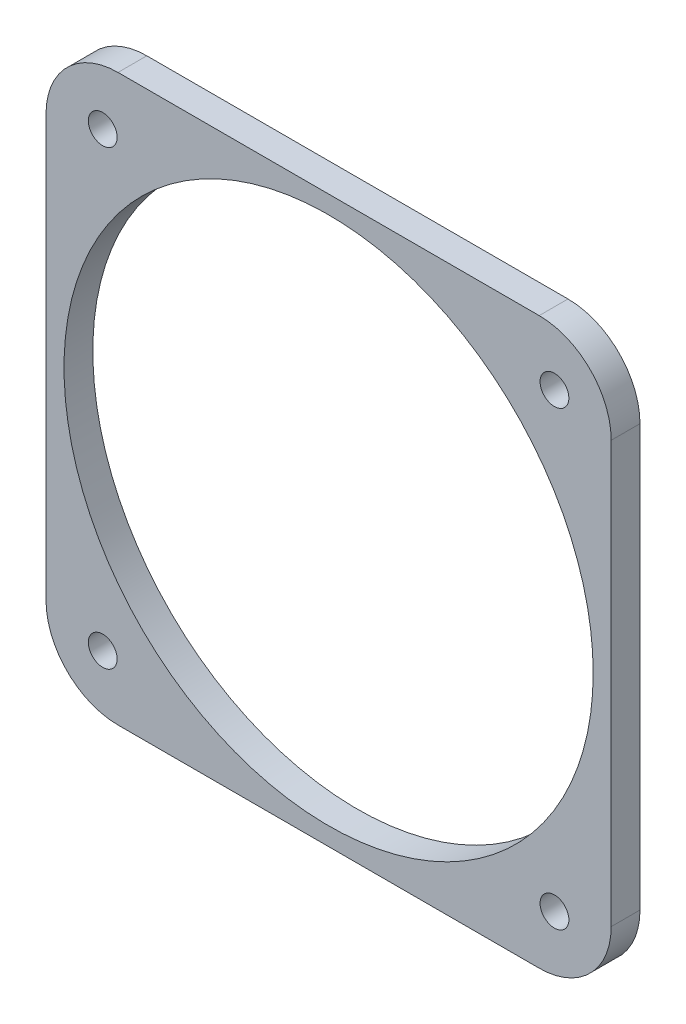
ISO-10303-21;
HEADER;
FILE_DESCRIPTION(('STEP AP214'),'2;1');
FILE_NAME('part.step','',(''),(''),'','','');
FILE_SCHEMA(('AUTOMOTIVE_DESIGN { 1 0 10303 214 1 1 1 1 }'));
ENDSEC;
DATA;
#1=APPLICATION_CONTEXT('core data for automotive mechanical design processes');
#2=APPLICATION_PROTOCOL_DEFINITION('international standard','automotive_design',2000,#1);
#3=PRODUCT_CONTEXT('',#1,'mechanical');
#4=PRODUCT('Part','Part','',(#3));
#5=PRODUCT_RELATED_PRODUCT_CATEGORY('part','',(#4));
#6=PRODUCT_DEFINITION_FORMATION('','',#4);
#7=PRODUCT_DEFINITION_CONTEXT('part definition',#1,'design');
#8=PRODUCT_DEFINITION('design','',#6,#7);
#9=PRODUCT_DEFINITION_SHAPE('','',#8);
#10=(LENGTH_UNIT() NAMED_UNIT(*) SI_UNIT(.MILLI.,.METRE.));
#11=(NAMED_UNIT(*) PLANE_ANGLE_UNIT() SI_UNIT($,.RADIAN.));
#12=(NAMED_UNIT(*) SI_UNIT($,.STERADIAN.) SOLID_ANGLE_UNIT());
#13=UNCERTAINTY_MEASURE_WITH_UNIT(LENGTH_MEASURE(1.E-05),#10,'distance_accuracy_value','');
#14=(GEOMETRIC_REPRESENTATION_CONTEXT(3) GLOBAL_UNCERTAINTY_ASSIGNED_CONTEXT((#13)) GLOBAL_UNIT_ASSIGNED_CONTEXT((#10,
#11,#12)) REPRESENTATION_CONTEXT('',''));
#15=CARTESIAN_POINT('',(0.,0.,0.));
#16=DIRECTION('',(0.,0.,1.));
#17=DIRECTION('',(1.,0.,0.));
#18=AXIS2_PLACEMENT_3D('',#15,#16,#17);
#19=CARTESIAN_POINT('',(39.25,-39.25,2.));
#20=DIRECTION('',(-1.,0.,0.));
#21=DIRECTION('',(0.,0.,1.));
#22=AXIS2_PLACEMENT_3D('',#19,#20,#21);
#23=PLANE('',#22);
#24=DIRECTION('',(0.,1.,0.));
#25=VECTOR('',#24,1.);
#26=CARTESIAN_POINT('',(39.25,-39.25,2.));
#27=LINE('',#26,#25);
#28=CARTESIAN_POINT('',(39.25,-29.25,2.));
#29=VERTEX_POINT('',#28);
#30=CARTESIAN_POINT('',(39.25,29.25,2.));
#31=VERTEX_POINT('',#30);
#32=EDGE_CURVE('E139',#29,#31,#27,.T.);
#33=ORIENTED_EDGE('',*,*,#32,.F.);
#34=DIRECTION('',(0.,0.,-1.));
#35=VECTOR('',#34,1.);
#36=CARTESIAN_POINT('',(39.25,-29.25,2.));
#37=LINE('',#36,#35);
#38=CARTESIAN_POINT('',(39.25,-29.25,-2.));
#39=VERTEX_POINT('',#38);
#40=EDGE_CURVE('E178',#29,#39,#37,.T.);
#41=ORIENTED_EDGE('',*,*,#40,.T.);
#42=DIRECTION('',(0.,1.,0.));
#43=VECTOR('',#42,1.);
#44=CARTESIAN_POINT('',(39.25,-39.25,-2.));
#45=LINE('',#44,#43);
#46=CARTESIAN_POINT('',(39.25,29.25,-2.));
#47=VERTEX_POINT('',#46);
#48=EDGE_CURVE('E193',#39,#47,#45,.T.);
#49=ORIENTED_EDGE('',*,*,#48,.T.);
#50=DIRECTION('',(0.,0.,-1.));
#51=VECTOR('',#50,1.);
#52=CARTESIAN_POINT('',(39.25,29.25,2.));
#53=LINE('',#52,#51);
#54=EDGE_CURVE('E175',#47,#31,#53,.F.);
#55=ORIENTED_EDGE('',*,*,#54,.T.);
#56=EDGE_LOOP('',(#33,#41,#49,#55));
#57=FACE_BOUND('',#56,.T.);
#58=ADVANCED_FACE('F43',(#57),#23,.F.);
#59=CARTESIAN_POINT('',(-39.25,39.25,2.));
#60=DIRECTION('',(0.,-1.,0.));
#61=DIRECTION('',(0.,0.,-1.));
#62=AXIS2_PLACEMENT_3D('',#59,#60,#61);
#63=PLANE('',#62);
#64=DIRECTION('',(-1.,0.,0.));
#65=VECTOR('',#64,1.);
#66=CARTESIAN_POINT('',(-39.25,39.25,2.));
#67=LINE('',#66,#65);
#68=CARTESIAN_POINT('',(29.25,39.25,2.));
#69=VERTEX_POINT('',#68);
#70=CARTESIAN_POINT('',(-29.25,39.25,2.));
#71=VERTEX_POINT('',#70);
#72=EDGE_CURVE('E144',#69,#71,#67,.T.);
#73=ORIENTED_EDGE('',*,*,#72,.F.);
#74=DIRECTION('',(0.,0.,-1.));
#75=VECTOR('',#74,1.);
#76=CARTESIAN_POINT('',(29.25,39.25,2.));
#77=LINE('',#76,#75);
#78=CARTESIAN_POINT('',(29.25,39.25,-2.));
#79=VERTEX_POINT('',#78);
#80=EDGE_CURVE('E11',#69,#79,#77,.T.);
#81=ORIENTED_EDGE('',*,*,#80,.T.);
#82=DIRECTION('',(-1.,0.,0.));
#83=VECTOR('',#82,1.);
#84=CARTESIAN_POINT('',(-39.25,39.25,-2.));
#85=LINE('',#84,#83);
#86=CARTESIAN_POINT('',(-29.25,39.25,-2.));
#87=VERTEX_POINT('',#86);
#88=EDGE_CURVE('E146',#79,#87,#85,.T.);
#89=ORIENTED_EDGE('',*,*,#88,.T.);
#90=DIRECTION('',(0.,0.,-1.));
#91=VECTOR('',#90,1.);
#92=CARTESIAN_POINT('',(-29.25,39.25,2.));
#93=LINE('',#92,#91);
#94=EDGE_CURVE('E52',#87,#71,#93,.F.);
#95=ORIENTED_EDGE('',*,*,#94,.T.);
#96=EDGE_LOOP('',(#73,#81,#89,#95));
#97=FACE_BOUND('',#96,.T.);
#98=ADVANCED_FACE('F199',(#97),#63,.F.);
#99=CARTESIAN_POINT('',(-39.25,-39.25,2.));
#100=DIRECTION('',(1.,0.,0.));
#101=DIRECTION('',(0.,0.,-1.));
#102=AXIS2_PLACEMENT_3D('',#99,#100,#101);
#103=PLANE('',#102);
#104=DIRECTION('',(0.,-1.,0.));
#105=VECTOR('',#104,1.);
#106=CARTESIAN_POINT('',(-39.25,-39.25,-2.));
#107=LINE('',#106,#105);
#108=CARTESIAN_POINT('',(-39.25,29.25,-2.));
#109=VERTEX_POINT('',#108);
#110=CARTESIAN_POINT('',(-39.25,-29.25,-2.));
#111=VERTEX_POINT('',#110);
#112=EDGE_CURVE('E140',#109,#111,#107,.T.);
#113=ORIENTED_EDGE('',*,*,#112,.T.);
#114=DIRECTION('',(0.,0.,-1.));
#115=VECTOR('',#114,1.);
#116=CARTESIAN_POINT('',(-39.25,-29.25,2.));
#117=LINE('',#116,#115);
#118=CARTESIAN_POINT('',(-39.25,-29.25,2.));
#119=VERTEX_POINT('',#118);
#120=EDGE_CURVE('E115',#111,#119,#117,.F.);
#121=ORIENTED_EDGE('',*,*,#120,.T.);
#122=DIRECTION('',(0.,-1.,0.));
#123=VECTOR('',#122,1.);
#124=CARTESIAN_POINT('',(-39.25,-39.25,2.));
#125=LINE('',#124,#123);
#126=CARTESIAN_POINT('',(-39.25,29.25,2.));
#127=VERTEX_POINT('',#126);
#128=EDGE_CURVE('E184',#127,#119,#125,.T.);
#129=ORIENTED_EDGE('',*,*,#128,.F.);
#130=DIRECTION('',(0.,0.,-1.));
#131=VECTOR('',#130,1.);
#132=CARTESIAN_POINT('',(-39.25,29.25,2.));
#133=LINE('',#132,#131);
#134=EDGE_CURVE('E121',#127,#109,#133,.T.);
#135=ORIENTED_EDGE('',*,*,#134,.T.);
#136=EDGE_LOOP('',(#113,#121,#129,#135));
#137=FACE_BOUND('',#136,.T.);
#138=ADVANCED_FACE('F206',(#137),#103,.F.);
#139=CARTESIAN_POINT('',(-39.25,-39.25,2.));
#140=DIRECTION('',(0.,1.,0.));
#141=DIRECTION('',(0.,0.,1.));
#142=AXIS2_PLACEMENT_3D('',#139,#140,#141);
#143=PLANE('',#142);
#144=DIRECTION('',(1.,0.,0.));
#145=VECTOR('',#144,1.);
#146=CARTESIAN_POINT('',(-39.25,-39.25,2.));
#147=LINE('',#146,#145);
#148=CARTESIAN_POINT('',(-29.25,-39.25,2.));
#149=VERTEX_POINT('',#148);
#150=CARTESIAN_POINT('',(29.25,-39.25,2.));
#151=VERTEX_POINT('',#150);
#152=EDGE_CURVE('E131',#149,#151,#147,.T.);
#153=ORIENTED_EDGE('',*,*,#152,.F.);
#154=DIRECTION('',(0.,0.,-1.));
#155=VECTOR('',#154,1.);
#156=CARTESIAN_POINT('',(-29.25,-39.25,2.));
#157=LINE('',#156,#155);
#158=CARTESIAN_POINT('',(-29.25,-39.25,-2.));
#159=VERTEX_POINT('',#158);
#160=EDGE_CURVE('E114',#149,#159,#157,.T.);
#161=ORIENTED_EDGE('',*,*,#160,.T.);
#162=DIRECTION('',(1.,0.,0.));
#163=VECTOR('',#162,1.);
#164=CARTESIAN_POINT('',(-39.25,-39.25,-2.));
#165=LINE('',#164,#163);
#166=CARTESIAN_POINT('',(29.25,-39.25,-2.));
#167=VERTEX_POINT('',#166);
#168=EDGE_CURVE('E128',#159,#167,#165,.T.);
#169=ORIENTED_EDGE('',*,*,#168,.T.);
#170=DIRECTION('',(0.,0.,-1.));
#171=VECTOR('',#170,1.);
#172=CARTESIAN_POINT('',(29.25,-39.25,2.));
#173=LINE('',#172,#171);
#174=EDGE_CURVE('E134',#167,#151,#173,.F.);
#175=ORIENTED_EDGE('',*,*,#174,.T.);
#176=EDGE_LOOP('',(#153,#161,#169,#175));
#177=FACE_BOUND('',#176,.T.);
#178=ADVANCED_FACE('F127',(#177),#143,.F.);
#179=CARTESIAN_POINT('',(0.,0.,2.));
#180=DIRECTION('',(0.,0.,-1.));
#181=DIRECTION('',(-1.,0.,0.));
#182=AXIS2_PLACEMENT_3D('',#179,#180,#181);
#183=PLANE('',#182);
#184=CARTESIAN_POINT('',(0.,0.,2.));
#185=DIRECTION('',(0.,0.,1.));
#186=DIRECTION('',(1.,0.,0.));
#187=AXIS2_PLACEMENT_3D('',#184,#185,#186);
#188=CIRCLE('',#187,36.75);
#189=CARTESIAN_POINT('',(36.75,0.,2.));
#190=VERTEX_POINT('',#189);
#191=EDGE_CURVE('E302',#190,#190,#188,.T.);
#192=ORIENTED_EDGE('',*,*,#191,.F.);
#193=EDGE_LOOP('',(#192));
#194=FACE_BOUND('',#193,.T.);
#195=CARTESIAN_POINT('',(-31.3713203435598,-31.3713203435595,2.));
#196=DIRECTION('',(0.,0.,1.));
#197=DIRECTION('',(-1.,0.,0.));
#198=AXIS2_PLACEMENT_3D('',#195,#196,#197);
#199=CIRCLE('',#198,2.);
#200=CARTESIAN_POINT('',(-33.3713203435598,-31.3713203435595,2.));
#201=VERTEX_POINT('',#200);
#202=EDGE_CURVE('E283',#201,#201,#199,.T.);
#203=ORIENTED_EDGE('',*,*,#202,.F.);
#204=EDGE_LOOP('',(#203));
#205=FACE_BOUND('',#204,.T.);
#206=CARTESIAN_POINT('',(31.3713203435598,31.3713203435595,2.));
#207=DIRECTION('',(0.,0.,1.));
#208=DIRECTION('',(-1.,0.,0.));
#209=AXIS2_PLACEMENT_3D('',#206,#207,#208);
#210=CIRCLE('',#209,2.);
#211=CARTESIAN_POINT('',(29.3713203435598,31.3713203435595,2.));
#212=VERTEX_POINT('',#211);
#213=EDGE_CURVE('E287',#212,#212,#210,.T.);
#214=ORIENTED_EDGE('',*,*,#213,.F.);
#215=EDGE_LOOP('',(#214));
#216=FACE_BOUND('',#215,.T.);
#217=CARTESIAN_POINT('',(31.3713203435598,-31.3713203435595,2.));
#218=DIRECTION('',(0.,0.,1.));
#219=DIRECTION('',(1.,0.,0.));
#220=AXIS2_PLACEMENT_3D('',#217,#218,#219);
#221=CIRCLE('',#220,2.);
#222=CARTESIAN_POINT('',(33.3713203435598,-31.3713203435595,2.));
#223=VERTEX_POINT('',#222);
#224=EDGE_CURVE('E288',#223,#223,#221,.T.);
#225=ORIENTED_EDGE('',*,*,#224,.F.);
#226=EDGE_LOOP('',(#225));
#227=FACE_BOUND('',#226,.T.);
#228=CARTESIAN_POINT('',(-31.3713203435598,31.3713203435595,2.));
#229=DIRECTION('',(0.,0.,1.));
#230=DIRECTION('',(1.,0.,0.));
#231=AXIS2_PLACEMENT_3D('',#228,#229,#230);
#232=CIRCLE('',#231,2.);
#233=CARTESIAN_POINT('',(-29.3713203435598,31.3713203435595,2.));
#234=VERTEX_POINT('',#233);
#235=EDGE_CURVE('E279',#234,#234,#232,.T.);
#236=ORIENTED_EDGE('',*,*,#235,.F.);
#237=EDGE_LOOP('',(#236));
#238=FACE_BOUND('',#237,.T.);
#239=ORIENTED_EDGE('',*,*,#128,.T.);
#240=CARTESIAN_POINT('',(-29.25,-29.25,2.));
#241=DIRECTION('',(0.,0.,-1.));
#242=DIRECTION('',(-1.,0.,0.));
#243=AXIS2_PLACEMENT_3D('',#240,#241,#242);
#244=CIRCLE('',#243,10.);
#245=EDGE_CURVE('E172',#119,#149,#244,.F.);
#246=ORIENTED_EDGE('',*,*,#245,.T.);
#247=ORIENTED_EDGE('',*,*,#152,.T.);
#248=CARTESIAN_POINT('',(29.25,-29.25,2.));
#249=DIRECTION('',(0.,0.,-1.));
#250=DIRECTION('',(-1.,0.,0.));
#251=AXIS2_PLACEMENT_3D('',#248,#249,#250);
#252=CIRCLE('',#251,10.);
#253=EDGE_CURVE('E169',#151,#29,#252,.F.);
#254=ORIENTED_EDGE('',*,*,#253,.T.);
#255=ORIENTED_EDGE('',*,*,#32,.T.);
#256=CARTESIAN_POINT('',(29.25,29.25,2.));
#257=DIRECTION('',(0.,0.,-1.));
#258=DIRECTION('',(-1.,0.,0.));
#259=AXIS2_PLACEMENT_3D('',#256,#257,#258);
#260=CIRCLE('',#259,10.);
#261=EDGE_CURVE('E65',#31,#69,#260,.F.);
#262=ORIENTED_EDGE('',*,*,#261,.T.);
#263=ORIENTED_EDGE('',*,*,#72,.T.);
#264=CARTESIAN_POINT('',(-29.25,29.25,2.));
#265=DIRECTION('',(0.,0.,-1.));
#266=DIRECTION('',(-1.,0.,0.));
#267=AXIS2_PLACEMENT_3D('',#264,#265,#266);
#268=CIRCLE('',#267,10.);
#269=EDGE_CURVE('E164',#71,#127,#268,.F.);
#270=ORIENTED_EDGE('',*,*,#269,.T.);
#271=EDGE_LOOP('',(#239,#246,#247,#254,#255,#262,#263,#270));
#272=FACE_BOUND('',#271,.T.);
#273=ADVANCED_FACE('F204',(#194,#205,#216,#227,#238,#272),#183,.F.);
#274=CARTESIAN_POINT('',(0.,0.,-2.));
#275=DIRECTION('',(0.,0.,-1.));
#276=DIRECTION('',(-1.,0.,0.));
#277=AXIS2_PLACEMENT_3D('',#274,#275,#276);
#278=PLANE('',#277);
#279=CARTESIAN_POINT('',(0.,0.,-2.));
#280=DIRECTION('',(0.,0.,1.));
#281=DIRECTION('',(1.,0.,0.));
#282=AXIS2_PLACEMENT_3D('',#279,#280,#281);
#283=CIRCLE('',#282,36.75);
#284=CARTESIAN_POINT('',(36.75,0.,-2.));
#285=VERTEX_POINT('',#284);
#286=EDGE_CURVE('E264',#285,#285,#283,.T.);
#287=ORIENTED_EDGE('',*,*,#286,.T.);
#288=EDGE_LOOP('',(#287));
#289=FACE_BOUND('',#288,.T.);
#290=CARTESIAN_POINT('',(-31.3713203435598,-31.3713203435595,-2.));
#291=DIRECTION('',(0.,0.,1.));
#292=DIRECTION('',(-1.,0.,0.));
#293=AXIS2_PLACEMENT_3D('',#290,#291,#292);
#294=CIRCLE('',#293,2.);
#295=CARTESIAN_POINT('',(-33.3713203435598,-31.3713203435595,-2.));
#296=VERTEX_POINT('',#295);
#297=EDGE_CURVE('E268',#296,#296,#294,.T.);
#298=ORIENTED_EDGE('',*,*,#297,.T.);
#299=EDGE_LOOP('',(#298));
#300=FACE_BOUND('',#299,.T.);
#301=CARTESIAN_POINT('',(31.3713203435598,31.3713203435595,-2.));
#302=DIRECTION('',(0.,0.,1.));
#303=DIRECTION('',(-1.,0.,0.));
#304=AXIS2_PLACEMENT_3D('',#301,#302,#303);
#305=CIRCLE('',#304,2.);
#306=CARTESIAN_POINT('',(29.3713203435598,31.3713203435595,-2.));
#307=VERTEX_POINT('',#306);
#308=EDGE_CURVE('E272',#307,#307,#305,.T.);
#309=ORIENTED_EDGE('',*,*,#308,.T.);
#310=EDGE_LOOP('',(#309));
#311=FACE_BOUND('',#310,.T.);
#312=CARTESIAN_POINT('',(31.3713203435598,-31.3713203435595,-2.));
#313=DIRECTION('',(0.,0.,1.));
#314=DIRECTION('',(1.,0.,0.));
#315=AXIS2_PLACEMENT_3D('',#312,#313,#314);
#316=CIRCLE('',#315,2.);
#317=CARTESIAN_POINT('',(33.3713203435598,-31.3713203435595,-2.));
#318=VERTEX_POINT('',#317);
#319=EDGE_CURVE('E276',#318,#318,#316,.T.);
#320=ORIENTED_EDGE('',*,*,#319,.T.);
#321=EDGE_LOOP('',(#320));
#322=FACE_BOUND('',#321,.T.);
#323=CARTESIAN_POINT('',(-31.3713203435598,31.3713203435595,-2.));
#324=DIRECTION('',(0.,0.,1.));
#325=DIRECTION('',(1.,0.,0.));
#326=AXIS2_PLACEMENT_3D('',#323,#324,#325);
#327=CIRCLE('',#326,2.);
#328=CARTESIAN_POINT('',(-29.3713203435598,31.3713203435595,-2.));
#329=VERTEX_POINT('',#328);
#330=EDGE_CURVE('E196',#329,#329,#327,.T.);
#331=ORIENTED_EDGE('',*,*,#330,.T.);
#332=EDGE_LOOP('',(#331));
#333=FACE_BOUND('',#332,.T.);
#334=ORIENTED_EDGE('',*,*,#168,.F.);
#335=CARTESIAN_POINT('',(-29.25,-29.25,-2.));
#336=DIRECTION('',(0.,0.,-1.));
#337=DIRECTION('',(-1.,0.,0.));
#338=AXIS2_PLACEMENT_3D('',#335,#336,#337);
#339=CIRCLE('',#338,10.);
#340=EDGE_CURVE('E110',#159,#111,#339,.T.);
#341=ORIENTED_EDGE('',*,*,#340,.T.);
#342=ORIENTED_EDGE('',*,*,#112,.F.);
#343=CARTESIAN_POINT('',(-29.25,29.25,-2.));
#344=DIRECTION('',(0.,0.,-1.));
#345=DIRECTION('',(-1.,0.,0.));
#346=AXIS2_PLACEMENT_3D('',#343,#344,#345);
#347=CIRCLE('',#346,10.);
#348=EDGE_CURVE('E133',#109,#87,#347,.T.);
#349=ORIENTED_EDGE('',*,*,#348,.T.);
#350=ORIENTED_EDGE('',*,*,#88,.F.);
#351=CARTESIAN_POINT('',(29.25,29.25,-2.));
#352=DIRECTION('',(0.,0.,-1.));
#353=DIRECTION('',(-1.,0.,0.));
#354=AXIS2_PLACEMENT_3D('',#351,#352,#353);
#355=CIRCLE('',#354,10.);
#356=EDGE_CURVE('E154',#79,#47,#355,.T.);
#357=ORIENTED_EDGE('',*,*,#356,.T.);
#358=ORIENTED_EDGE('',*,*,#48,.F.);
#359=CARTESIAN_POINT('',(29.25,-29.25,-2.));
#360=DIRECTION('',(0.,0.,-1.));
#361=DIRECTION('',(-1.,0.,0.));
#362=AXIS2_PLACEMENT_3D('',#359,#360,#361);
#363=CIRCLE('',#362,10.);
#364=EDGE_CURVE('E122',#39,#167,#363,.T.);
#365=ORIENTED_EDGE('',*,*,#364,.T.);
#366=EDGE_LOOP('',(#334,#341,#342,#349,#350,#357,#358,#365));
#367=FACE_BOUND('',#366,.T.);
#368=ADVANCED_FACE('F136',(#289,#300,#311,#322,#333,#367),#278,.T.);
#369=CARTESIAN_POINT('',(-29.25,-29.25,2.));
#370=DIRECTION('',(0.,0.,-1.));
#371=DIRECTION('',(-1.,0.,0.));
#372=AXIS2_PLACEMENT_3D('',#369,#370,#371);
#373=CYLINDRICAL_SURFACE('',#372,10.);
#374=ORIENTED_EDGE('',*,*,#245,.F.);
#375=ORIENTED_EDGE('',*,*,#120,.F.);
#376=ORIENTED_EDGE('',*,*,#340,.F.);
#377=ORIENTED_EDGE('',*,*,#160,.F.);
#378=EDGE_LOOP('',(#374,#375,#376,#377));
#379=FACE_BOUND('',#378,.T.);
#380=ADVANCED_FACE('F113',(#379),#373,.T.);
#381=CARTESIAN_POINT('',(29.25,-29.25,2.));
#382=DIRECTION('',(0.,0.,-1.));
#383=DIRECTION('',(-1.,0.,0.));
#384=AXIS2_PLACEMENT_3D('',#381,#382,#383);
#385=CYLINDRICAL_SURFACE('',#384,10.);
#386=ORIENTED_EDGE('',*,*,#253,.F.);
#387=ORIENTED_EDGE('',*,*,#174,.F.);
#388=ORIENTED_EDGE('',*,*,#364,.F.);
#389=ORIENTED_EDGE('',*,*,#40,.F.);
#390=EDGE_LOOP('',(#386,#387,#388,#389));
#391=FACE_BOUND('',#390,.T.);
#392=ADVANCED_FACE('F224',(#391),#385,.T.);
#393=CARTESIAN_POINT('',(29.25,29.25,2.));
#394=DIRECTION('',(0.,0.,-1.));
#395=DIRECTION('',(-1.,0.,0.));
#396=AXIS2_PLACEMENT_3D('',#393,#394,#395);
#397=CYLINDRICAL_SURFACE('',#396,10.);
#398=ORIENTED_EDGE('',*,*,#261,.F.);
#399=ORIENTED_EDGE('',*,*,#54,.F.);
#400=ORIENTED_EDGE('',*,*,#356,.F.);
#401=ORIENTED_EDGE('',*,*,#80,.F.);
#402=EDGE_LOOP('',(#398,#399,#400,#401));
#403=FACE_BOUND('',#402,.T.);
#404=ADVANCED_FACE('F226',(#403),#397,.T.);
#405=CARTESIAN_POINT('',(-29.25,29.25,2.));
#406=DIRECTION('',(0.,0.,-1.));
#407=DIRECTION('',(-1.,0.,0.));
#408=AXIS2_PLACEMENT_3D('',#405,#406,#407);
#409=CYLINDRICAL_SURFACE('',#408,10.);
#410=ORIENTED_EDGE('',*,*,#269,.F.);
#411=ORIENTED_EDGE('',*,*,#94,.F.);
#412=ORIENTED_EDGE('',*,*,#348,.F.);
#413=ORIENTED_EDGE('',*,*,#134,.F.);
#414=EDGE_LOOP('',(#410,#411,#412,#413));
#415=FACE_BOUND('',#414,.T.);
#416=ADVANCED_FACE('F45',(#415),#409,.T.);
#417=CARTESIAN_POINT('',(-31.3713203435598,31.3713203435595,-2.));
#418=DIRECTION('',(0.,0.,1.));
#419=DIRECTION('',(1.,0.,0.));
#420=AXIS2_PLACEMENT_3D('',#417,#418,#419);
#421=CYLINDRICAL_SURFACE('',#420,2.);
#422=ORIENTED_EDGE('',*,*,#330,.F.);
#423=EDGE_LOOP('',(#422));
#424=FACE_BOUND('',#423,.T.);
#425=ORIENTED_EDGE('',*,*,#235,.T.);
#426=EDGE_LOOP('',(#425));
#427=FACE_BOUND('',#426,.T.);
#428=ADVANCED_FACE('F233',(#424,#427),#421,.F.);
#429=CARTESIAN_POINT('',(31.3713203435598,-31.3713203435595,-2.));
#430=DIRECTION('',(0.,0.,1.));
#431=DIRECTION('',(1.,0.,0.));
#432=AXIS2_PLACEMENT_3D('',#429,#430,#431);
#433=CYLINDRICAL_SURFACE('',#432,2.);
#434=ORIENTED_EDGE('',*,*,#319,.F.);
#435=EDGE_LOOP('',(#434));
#436=FACE_BOUND('',#435,.T.);
#437=ORIENTED_EDGE('',*,*,#224,.T.);
#438=EDGE_LOOP('',(#437));
#439=FACE_BOUND('',#438,.T.);
#440=ADVANCED_FACE('F240',(#436,#439),#433,.F.);
#441=CARTESIAN_POINT('',(31.3713203435598,31.3713203435595,-2.));
#442=DIRECTION('',(0.,0.,1.));
#443=DIRECTION('',(1.,0.,0.));
#444=AXIS2_PLACEMENT_3D('',#441,#442,#443);
#445=CYLINDRICAL_SURFACE('',#444,2.);
#446=ORIENTED_EDGE('',*,*,#308,.F.);
#447=EDGE_LOOP('',(#446));
#448=FACE_BOUND('',#447,.T.);
#449=ORIENTED_EDGE('',*,*,#213,.T.);
#450=EDGE_LOOP('',(#449));
#451=FACE_BOUND('',#450,.T.);
#452=ADVANCED_FACE('F246',(#448,#451),#445,.F.);
#453=CARTESIAN_POINT('',(-31.3713203435598,-31.3713203435595,-2.));
#454=DIRECTION('',(0.,0.,1.));
#455=DIRECTION('',(1.,0.,0.));
#456=AXIS2_PLACEMENT_3D('',#453,#454,#455);
#457=CYLINDRICAL_SURFACE('',#456,2.);
#458=ORIENTED_EDGE('',*,*,#297,.F.);
#459=EDGE_LOOP('',(#458));
#460=FACE_BOUND('',#459,.T.);
#461=ORIENTED_EDGE('',*,*,#202,.T.);
#462=EDGE_LOOP('',(#461));
#463=FACE_BOUND('',#462,.T.);
#464=ADVANCED_FACE('F321',(#460,#463),#457,.F.);
#465=CARTESIAN_POINT('',(0.,0.,-2.));
#466=DIRECTION('',(0.,0.,1.));
#467=DIRECTION('',(1.,0.,0.));
#468=AXIS2_PLACEMENT_3D('',#465,#466,#467);
#469=CYLINDRICAL_SURFACE('',#468,36.75);
#470=ORIENTED_EDGE('',*,*,#286,.F.);
#471=EDGE_LOOP('',(#470));
#472=FACE_BOUND('',#471,.T.);
#473=ORIENTED_EDGE('',*,*,#191,.T.);
#474=EDGE_LOOP('',(#473));
#475=FACE_BOUND('',#474,.T.);
#476=ADVANCED_FACE('F309',(#472,#475),#469,.F.);
#477=CLOSED_SHELL('',(#58,#98,#138,#178,#273,#368,#380,#392,#404,#416,#428,#440,#452,#464,#476));
#478=MANIFOLD_SOLID_BREP('B2',#477);
#479=ADVANCED_BREP_SHAPE_REPRESENTATION('',(#18,#478),#14);
#480=SHAPE_DEFINITION_REPRESENTATION(#9,#479);
ENDSEC;
END-ISO-10303-21;
